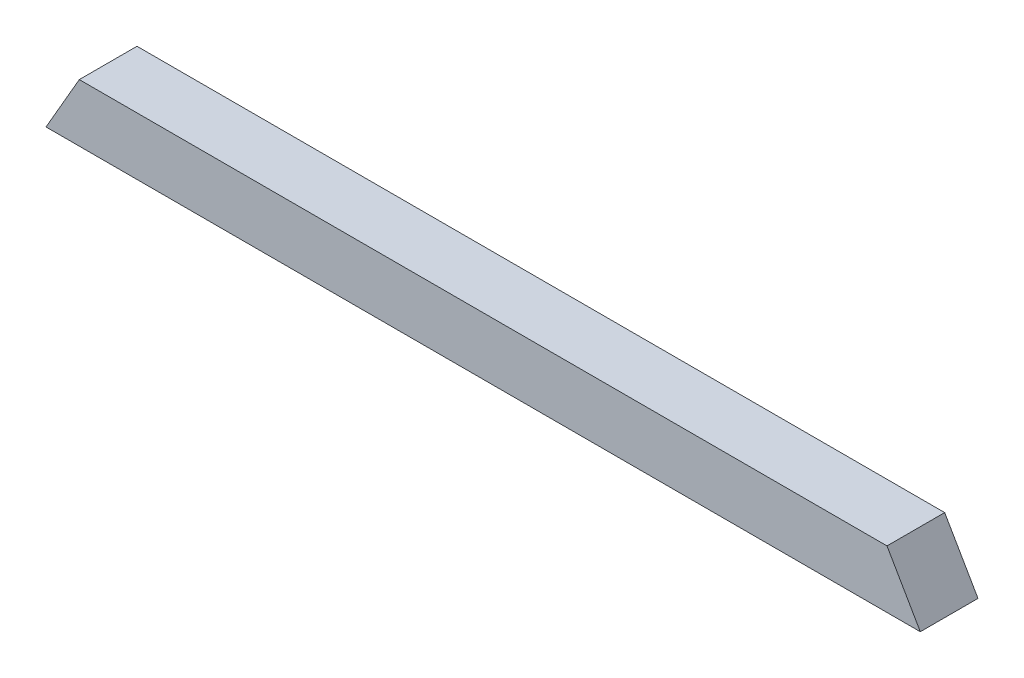
ISO-10303-21;
HEADER;
FILE_DESCRIPTION(('STEP AP214'),'2;1');
FILE_NAME('part.step','',(''),(''),'','','');
FILE_SCHEMA(('AUTOMOTIVE_DESIGN { 1 0 10303 214 1 1 1 1 }'));
ENDSEC;
DATA;
#1=APPLICATION_CONTEXT('core data for automotive mechanical design processes');
#2=APPLICATION_PROTOCOL_DEFINITION('international standard','automotive_design',2000,#1);
#3=PRODUCT_CONTEXT('',#1,'mechanical');
#4=PRODUCT('Part','Part','',(#3));
#5=PRODUCT_RELATED_PRODUCT_CATEGORY('part','',(#4));
#6=PRODUCT_DEFINITION_FORMATION('','',#4);
#7=PRODUCT_DEFINITION_CONTEXT('part definition',#1,'design');
#8=PRODUCT_DEFINITION('design','',#6,#7);
#9=PRODUCT_DEFINITION_SHAPE('','',#8);
#10=(LENGTH_UNIT() NAMED_UNIT(*) SI_UNIT(.MILLI.,.METRE.));
#11=(NAMED_UNIT(*) PLANE_ANGLE_UNIT() SI_UNIT($,.RADIAN.));
#12=(NAMED_UNIT(*) SI_UNIT($,.STERADIAN.) SOLID_ANGLE_UNIT());
#13=UNCERTAINTY_MEASURE_WITH_UNIT(LENGTH_MEASURE(1.E-05),#10,'distance_accuracy_value','');
#14=(GEOMETRIC_REPRESENTATION_CONTEXT(3) GLOBAL_UNCERTAINTY_ASSIGNED_CONTEXT((#13)) GLOBAL_UNIT_ASSIGNED_CONTEXT((#10,
#11,#12)) REPRESENTATION_CONTEXT('',''));
#15=CARTESIAN_POINT('',(0.,0.,0.));
#16=DIRECTION('',(0.,0.,1.));
#17=DIRECTION('',(1.,0.,0.));
#18=AXIS2_PLACEMENT_3D('',#15,#16,#17);
#19=CARTESIAN_POINT('',(140.,0.,20.));
#20=DIRECTION('',(-0.86602540378444,-0.499999999999998,0.));
#21=DIRECTION('',(0.499999999999998,-0.86602540378444,0.));
#22=AXIS2_PLACEMENT_3D('',#19,#20,#21);
#23=PLANE('',#22);
#24=DIRECTION('',(-0.499999999999998,0.86602540378444,0.));
#25=VECTOR('',#24,1.);
#26=CARTESIAN_POINT('',(140.,0.,0.));
#27=LINE('',#26,#25);
#28=CARTESIAN_POINT('',(151.547005383792,-19.9999999999999,0.));
#29=VERTEX_POINT('',#28);
#30=CARTESIAN_POINT('',(140.,0.,0.));
#31=VERTEX_POINT('',#30);
#32=EDGE_CURVE('E96',#29,#31,#27,.T.);
#33=ORIENTED_EDGE('',*,*,#32,.T.);
#34=DIRECTION('',(0.,0.,-1.));
#35=VECTOR('',#34,1.);
#36=CARTESIAN_POINT('',(140.,0.,20.));
#37=LINE('',#36,#35);
#38=CARTESIAN_POINT('',(140.,0.,20.));
#39=VERTEX_POINT('',#38);
#40=EDGE_CURVE('E11',#39,#31,#37,.T.);
#41=ORIENTED_EDGE('',*,*,#40,.F.);
#42=DIRECTION('',(-0.499999999999998,0.86602540378444,0.));
#43=VECTOR('',#42,1.);
#44=CARTESIAN_POINT('',(140.,0.,20.));
#45=LINE('',#44,#43);
#46=CARTESIAN_POINT('',(151.547005383792,-19.9999999999999,20.));
#47=VERTEX_POINT('',#46);
#48=EDGE_CURVE('E84',#47,#39,#45,.T.);
#49=ORIENTED_EDGE('',*,*,#48,.F.);
#50=DIRECTION('',(0.,0.,-1.));
#51=VECTOR('',#50,1.);
#52=CARTESIAN_POINT('',(151.547005383792,-19.9999999999999,20.));
#53=LINE('',#52,#51);
#54=EDGE_CURVE('E92',#47,#29,#53,.T.);
#55=ORIENTED_EDGE('',*,*,#54,.T.);
#56=EDGE_LOOP('',(#33,#41,#49,#55));
#57=FACE_BOUND('',#56,.T.);
#58=ADVANCED_FACE('F33',(#57),#23,.F.);
#59=CARTESIAN_POINT('',(-140.,0.,20.));
#60=DIRECTION('',(0.,-1.,0.));
#61=DIRECTION('',(1.,0.,0.));
#62=AXIS2_PLACEMENT_3D('',#59,#60,#61);
#63=PLANE('',#62);
#64=DIRECTION('',(-1.,0.,0.));
#65=VECTOR('',#64,1.);
#66=CARTESIAN_POINT('',(-140.,0.,0.));
#67=LINE('',#66,#65);
#68=CARTESIAN_POINT('',(-140.,0.,0.));
#69=VERTEX_POINT('',#68);
#70=EDGE_CURVE('E88',#31,#69,#67,.T.);
#71=ORIENTED_EDGE('',*,*,#70,.T.);
#72=DIRECTION('',(0.,0.,-1.));
#73=VECTOR('',#72,1.);
#74=CARTESIAN_POINT('',(-140.,0.,20.));
#75=LINE('',#74,#73);
#76=CARTESIAN_POINT('',(-140.,0.,20.));
#77=VERTEX_POINT('',#76);
#78=EDGE_CURVE('E41',#77,#69,#75,.T.);
#79=ORIENTED_EDGE('',*,*,#78,.F.);
#80=DIRECTION('',(-1.,0.,0.));
#81=VECTOR('',#80,1.);
#82=CARTESIAN_POINT('',(-140.,0.,20.));
#83=LINE('',#82,#81);
#84=EDGE_CURVE('E79',#39,#77,#83,.T.);
#85=ORIENTED_EDGE('',*,*,#84,.F.);
#86=ORIENTED_EDGE('',*,*,#40,.T.);
#87=EDGE_LOOP('',(#71,#79,#85,#86));
#88=FACE_BOUND('',#87,.T.);
#89=ADVANCED_FACE('F87',(#88),#63,.F.);
#90=CARTESIAN_POINT('',(-140.,0.,20.));
#91=DIRECTION('',(0.86602540378444,-0.499999999999998,0.));
#92=DIRECTION('',(0.499999999999998,0.86602540378444,0.));
#93=AXIS2_PLACEMENT_3D('',#90,#91,#92);
#94=PLANE('',#93);
#95=DIRECTION('',(-0.499999999999998,-0.86602540378444,0.));
#96=VECTOR('',#95,1.);
#97=CARTESIAN_POINT('',(-140.,0.,0.));
#98=LINE('',#97,#96);
#99=CARTESIAN_POINT('',(-151.547005383792,-20.,0.));
#100=VERTEX_POINT('',#99);
#101=EDGE_CURVE('E66',#69,#100,#98,.T.);
#102=ORIENTED_EDGE('',*,*,#101,.T.);
#103=DIRECTION('',(0.,0.,-1.));
#104=VECTOR('',#103,1.);
#105=CARTESIAN_POINT('',(-151.547005383792,-20.,20.));
#106=LINE('',#105,#104);
#107=CARTESIAN_POINT('',(-151.547005383792,-20.,20.));
#108=VERTEX_POINT('',#107);
#109=EDGE_CURVE('E89',#108,#100,#106,.T.);
#110=ORIENTED_EDGE('',*,*,#109,.F.);
#111=DIRECTION('',(-0.499999999999998,-0.86602540378444,0.));
#112=VECTOR('',#111,1.);
#113=CARTESIAN_POINT('',(-140.,0.,20.));
#114=LINE('',#113,#112);
#115=EDGE_CURVE('E82',#77,#108,#114,.T.);
#116=ORIENTED_EDGE('',*,*,#115,.F.);
#117=ORIENTED_EDGE('',*,*,#78,.T.);
#118=EDGE_LOOP('',(#102,#110,#116,#117));
#119=FACE_BOUND('',#118,.T.);
#120=ADVANCED_FACE('F90',(#119),#94,.F.);
#121=CARTESIAN_POINT('',(-151.547005383792,-20.,20.));
#122=DIRECTION('',(0.,1.,0.));
#123=DIRECTION('',(-1.,0.,0.));
#124=AXIS2_PLACEMENT_3D('',#121,#122,#123);
#125=PLANE('',#124);
#126=DIRECTION('',(1.,0.,0.));
#127=VECTOR('',#126,1.);
#128=CARTESIAN_POINT('',(-151.547005383792,-20.,0.));
#129=LINE('',#128,#127);
#130=EDGE_CURVE('E72',#100,#29,#129,.T.);
#131=ORIENTED_EDGE('',*,*,#130,.T.);
#132=ORIENTED_EDGE('',*,*,#54,.F.);
#133=DIRECTION('',(1.,0.,0.));
#134=VECTOR('',#133,1.);
#135=CARTESIAN_POINT('',(-151.547005383792,-20.,20.));
#136=LINE('',#135,#134);
#137=EDGE_CURVE('E49',#108,#47,#136,.T.);
#138=ORIENTED_EDGE('',*,*,#137,.F.);
#139=ORIENTED_EDGE('',*,*,#109,.T.);
#140=EDGE_LOOP('',(#131,#132,#138,#139));
#141=FACE_BOUND('',#140,.T.);
#142=ADVANCED_FACE('F103',(#141),#125,.F.);
#143=CARTESIAN_POINT('',(0.,0.,20.));
#144=DIRECTION('',(0.,0.,1.));
#145=DIRECTION('',(1.,0.,0.));
#146=AXIS2_PLACEMENT_3D('',#143,#144,#145);
#147=PLANE('',#146);
#148=ORIENTED_EDGE('',*,*,#48,.T.);
#149=ORIENTED_EDGE('',*,*,#84,.T.);
#150=ORIENTED_EDGE('',*,*,#115,.T.);
#151=ORIENTED_EDGE('',*,*,#137,.T.);
#152=EDGE_LOOP('',(#148,#149,#150,#151));
#153=FACE_BOUND('',#152,.T.);
#154=ADVANCED_FACE('F80',(#153),#147,.T.);
#155=CARTESIAN_POINT('',(0.,0.,0.));
#156=DIRECTION('',(0.,0.,1.));
#157=DIRECTION('',(1.,0.,0.));
#158=AXIS2_PLACEMENT_3D('',#155,#156,#157);
#159=PLANE('',#158);
#160=ORIENTED_EDGE('',*,*,#32,.F.);
#161=ORIENTED_EDGE('',*,*,#130,.F.);
#162=ORIENTED_EDGE('',*,*,#101,.F.);
#163=ORIENTED_EDGE('',*,*,#70,.F.);
#164=EDGE_LOOP('',(#160,#161,#162,#163));
#165=FACE_BOUND('',#164,.T.);
#166=ADVANCED_FACE('F106',(#165),#159,.F.);
#167=CLOSED_SHELL('',(#58,#89,#120,#142,#154,#166));
#168=MANIFOLD_SOLID_BREP('B2',#167);
#169=ADVANCED_BREP_SHAPE_REPRESENTATION('',(#18,#168),#14);
#170=SHAPE_DEFINITION_REPRESENTATION(#9,#169);
ENDSEC;
END-ISO-10303-21;
